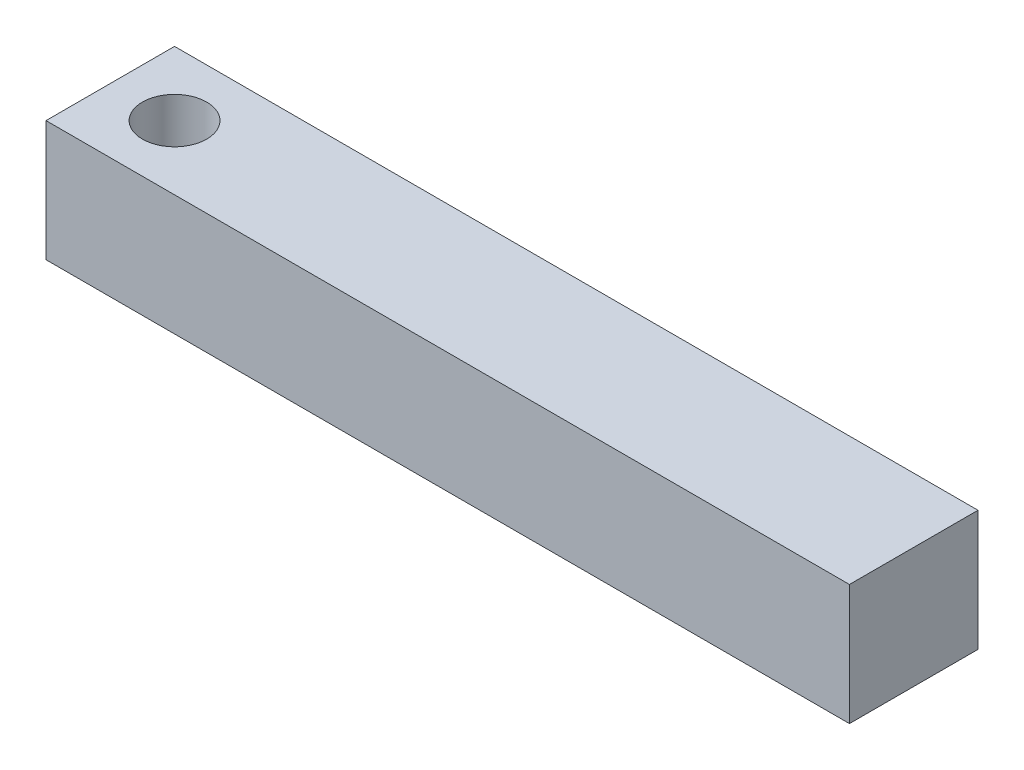
ISO-10303-21;
HEADER;
FILE_DESCRIPTION(('STEP AP214'),'2;1');
FILE_NAME('part.step','',(''),(''),'','','');
FILE_SCHEMA(('AUTOMOTIVE_DESIGN { 1 0 10303 214 1 1 1 1 }'));
ENDSEC;
DATA;
#1=APPLICATION_CONTEXT('core data for automotive mechanical design processes');
#2=APPLICATION_PROTOCOL_DEFINITION('international standard','automotive_design',2000,#1);
#3=PRODUCT_CONTEXT('',#1,'mechanical');
#4=PRODUCT('Part','Part','',(#3));
#5=PRODUCT_RELATED_PRODUCT_CATEGORY('part','',(#4));
#6=PRODUCT_DEFINITION_FORMATION('','',#4);
#7=PRODUCT_DEFINITION_CONTEXT('part definition',#1,'design');
#8=PRODUCT_DEFINITION('design','',#6,#7);
#9=PRODUCT_DEFINITION_SHAPE('','',#8);
#10=(LENGTH_UNIT() NAMED_UNIT(*) SI_UNIT(.MILLI.,.METRE.));
#11=(NAMED_UNIT(*) PLANE_ANGLE_UNIT() SI_UNIT($,.RADIAN.));
#12=(NAMED_UNIT(*) SI_UNIT($,.STERADIAN.) SOLID_ANGLE_UNIT());
#13=UNCERTAINTY_MEASURE_WITH_UNIT(LENGTH_MEASURE(1.E-05),#10,'distance_accuracy_value','');
#14=(GEOMETRIC_REPRESENTATION_CONTEXT(3) GLOBAL_UNCERTAINTY_ASSIGNED_CONTEXT((#13)) GLOBAL_UNIT_ASSIGNED_CONTEXT((#10,
#11,#12)) REPRESENTATION_CONTEXT('',''));
#15=CARTESIAN_POINT('',(0.,0.,0.));
#16=DIRECTION('',(0.,0.,1.));
#17=DIRECTION('',(1.,0.,0.));
#18=AXIS2_PLACEMENT_3D('',#15,#16,#17);
#19=CARTESIAN_POINT('',(0.,15.,0.));
#20=DIRECTION('',(0.,1.,0.));
#21=DIRECTION('',(0.,0.,1.));
#22=AXIS2_PLACEMENT_3D('',#19,#20,#21);
#23=PLANE('',#22);
#24=DIRECTION('',(0.,0.,-1.));
#25=VECTOR('',#24,1.);
#26=CARTESIAN_POINT('',(50.,15.,-8.));
#27=LINE('',#26,#25);
#28=CARTESIAN_POINT('',(50.,15.,8.));
#29=VERTEX_POINT('',#28);
#30=CARTESIAN_POINT('',(50.,15.,-8.));
#31=VERTEX_POINT('',#30);
#32=EDGE_CURVE('E85',#29,#31,#27,.T.);
#33=ORIENTED_EDGE('',*,*,#32,.T.);
#34=DIRECTION('',(-1.,0.,0.));
#35=VECTOR('',#34,1.);
#36=CARTESIAN_POINT('',(-50.,15.,-8.));
#37=LINE('',#36,#35);
#38=CARTESIAN_POINT('',(-50.,15.,-8.));
#39=VERTEX_POINT('',#38);
#40=EDGE_CURVE('E80',#31,#39,#37,.T.);
#41=ORIENTED_EDGE('',*,*,#40,.T.);
#42=DIRECTION('',(0.,0.,1.));
#43=VECTOR('',#42,1.);
#44=CARTESIAN_POINT('',(-50.,15.,-8.));
#45=LINE('',#44,#43);
#46=CARTESIAN_POINT('',(-50.,15.,8.));
#47=VERTEX_POINT('',#46);
#48=EDGE_CURVE('E83',#39,#47,#45,.T.);
#49=ORIENTED_EDGE('',*,*,#48,.T.);
#50=DIRECTION('',(1.,0.,0.));
#51=VECTOR('',#50,1.);
#52=CARTESIAN_POINT('',(-50.,15.,8.));
#53=LINE('',#52,#51);
#54=EDGE_CURVE('E50',#47,#29,#53,.T.);
#55=ORIENTED_EDGE('',*,*,#54,.T.);
#56=EDGE_LOOP('',(#33,#41,#49,#55));
#57=FACE_BOUND('',#56,.T.);
#58=CARTESIAN_POINT('',(-42.,15.,0.));
#59=DIRECTION('',(0.,1.,0.));
#60=DIRECTION('',(0.,0.,1.));
#61=AXIS2_PLACEMENT_3D('',#58,#59,#60);
#62=CIRCLE('',#61,4.00000000000001);
#63=CARTESIAN_POINT('',(-42.,15.,4.00000000000001));
#64=VERTEX_POINT('',#63);
#65=EDGE_CURVE('E100',#64,#64,#62,.T.);
#66=ORIENTED_EDGE('',*,*,#65,.F.);
#67=EDGE_LOOP('',(#66));
#68=FACE_BOUND('',#67,.T.);
#69=ADVANCED_FACE('F33',(#57,#68),#23,.T.);
#70=CARTESIAN_POINT('',(0.,0.,0.));
#71=DIRECTION('',(0.,1.,0.));
#72=DIRECTION('',(0.,0.,1.));
#73=AXIS2_PLACEMENT_3D('',#70,#71,#72);
#74=PLANE('',#73);
#75=DIRECTION('',(0.,0.,-1.));
#76=VECTOR('',#75,1.);
#77=CARTESIAN_POINT('',(50.,0.,-8.));
#78=LINE('',#77,#76);
#79=CARTESIAN_POINT('',(50.,0.,8.));
#80=VERTEX_POINT('',#79);
#81=CARTESIAN_POINT('',(50.,0.,-8.));
#82=VERTEX_POINT('',#81);
#83=EDGE_CURVE('E97',#80,#82,#78,.T.);
#84=ORIENTED_EDGE('',*,*,#83,.F.);
#85=DIRECTION('',(1.,0.,0.));
#86=VECTOR('',#85,1.);
#87=CARTESIAN_POINT('',(-50.,0.,8.));
#88=LINE('',#87,#86);
#89=CARTESIAN_POINT('',(-50.,0.,8.));
#90=VERTEX_POINT('',#89);
#91=EDGE_CURVE('E73',#90,#80,#88,.T.);
#92=ORIENTED_EDGE('',*,*,#91,.F.);
#93=DIRECTION('',(0.,0.,1.));
#94=VECTOR('',#93,1.);
#95=CARTESIAN_POINT('',(-50.,0.,-8.));
#96=LINE('',#95,#94);
#97=CARTESIAN_POINT('',(-50.,0.,-8.));
#98=VERTEX_POINT('',#97);
#99=EDGE_CURVE('E67',#98,#90,#96,.T.);
#100=ORIENTED_EDGE('',*,*,#99,.F.);
#101=DIRECTION('',(-1.,0.,0.));
#102=VECTOR('',#101,1.);
#103=CARTESIAN_POINT('',(-50.,0.,-8.));
#104=LINE('',#103,#102);
#105=EDGE_CURVE('E89',#82,#98,#104,.T.);
#106=ORIENTED_EDGE('',*,*,#105,.F.);
#107=EDGE_LOOP('',(#84,#92,#100,#106));
#108=FACE_BOUND('',#107,.T.);
#109=CARTESIAN_POINT('',(-42.,0.,0.));
#110=DIRECTION('',(0.,1.,0.));
#111=DIRECTION('',(0.,0.,1.));
#112=AXIS2_PLACEMENT_3D('',#109,#110,#111);
#113=CIRCLE('',#112,4.00000000000001);
#114=CARTESIAN_POINT('',(-42.,0.,4.00000000000001));
#115=VERTEX_POINT('',#114);
#116=EDGE_CURVE('E112',#115,#115,#113,.T.);
#117=ORIENTED_EDGE('',*,*,#116,.T.);
#118=EDGE_LOOP('',(#117));
#119=FACE_BOUND('',#118,.T.);
#120=ADVANCED_FACE('F108',(#108,#119),#74,.F.);
#121=CARTESIAN_POINT('',(50.,15.,-8.));
#122=DIRECTION('',(-1.,0.,0.));
#123=DIRECTION('',(0.,0.,1.));
#124=AXIS2_PLACEMENT_3D('',#121,#122,#123);
#125=PLANE('',#124);
#126=ORIENTED_EDGE('',*,*,#83,.T.);
#127=DIRECTION('',(0.,-1.,0.));
#128=VECTOR('',#127,1.);
#129=CARTESIAN_POINT('',(50.,15.,-8.));
#130=LINE('',#129,#128);
#131=EDGE_CURVE('E11',#31,#82,#130,.T.);
#132=ORIENTED_EDGE('',*,*,#131,.F.);
#133=ORIENTED_EDGE('',*,*,#32,.F.);
#134=DIRECTION('',(0.,-1.,0.));
#135=VECTOR('',#134,1.);
#136=CARTESIAN_POINT('',(50.,15.,8.));
#137=LINE('',#136,#135);
#138=EDGE_CURVE('E93',#29,#80,#137,.T.);
#139=ORIENTED_EDGE('',*,*,#138,.T.);
#140=EDGE_LOOP('',(#126,#132,#133,#139));
#141=FACE_BOUND('',#140,.T.);
#142=ADVANCED_FACE('F35',(#141),#125,.F.);
#143=CARTESIAN_POINT('',(-50.,15.,-8.));
#144=DIRECTION('',(0.,0.,1.));
#145=DIRECTION('',(1.,0.,0.));
#146=AXIS2_PLACEMENT_3D('',#143,#144,#145);
#147=PLANE('',#146);
#148=ORIENTED_EDGE('',*,*,#105,.T.);
#149=DIRECTION('',(0.,-1.,0.));
#150=VECTOR('',#149,1.);
#151=CARTESIAN_POINT('',(-50.,15.,-8.));
#152=LINE('',#151,#150);
#153=EDGE_CURVE('E42',#39,#98,#152,.T.);
#154=ORIENTED_EDGE('',*,*,#153,.F.);
#155=ORIENTED_EDGE('',*,*,#40,.F.);
#156=ORIENTED_EDGE('',*,*,#131,.T.);
#157=EDGE_LOOP('',(#148,#154,#155,#156));
#158=FACE_BOUND('',#157,.T.);
#159=ADVANCED_FACE('F88',(#158),#147,.F.);
#160=CARTESIAN_POINT('',(-50.,15.,-8.));
#161=DIRECTION('',(1.,0.,0.));
#162=DIRECTION('',(0.,0.,-1.));
#163=AXIS2_PLACEMENT_3D('',#160,#161,#162);
#164=PLANE('',#163);
#165=ORIENTED_EDGE('',*,*,#99,.T.);
#166=DIRECTION('',(0.,-1.,0.));
#167=VECTOR('',#166,1.);
#168=CARTESIAN_POINT('',(-50.,15.,8.));
#169=LINE('',#168,#167);
#170=EDGE_CURVE('E90',#47,#90,#169,.T.);
#171=ORIENTED_EDGE('',*,*,#170,.F.);
#172=ORIENTED_EDGE('',*,*,#48,.F.);
#173=ORIENTED_EDGE('',*,*,#153,.T.);
#174=EDGE_LOOP('',(#165,#171,#172,#173));
#175=FACE_BOUND('',#174,.T.);
#176=ADVANCED_FACE('F91',(#175),#164,.F.);
#177=CARTESIAN_POINT('',(-50.,15.,8.));
#178=DIRECTION('',(0.,0.,-1.));
#179=DIRECTION('',(-1.,0.,0.));
#180=AXIS2_PLACEMENT_3D('',#177,#178,#179);
#181=PLANE('',#180);
#182=ORIENTED_EDGE('',*,*,#91,.T.);
#183=ORIENTED_EDGE('',*,*,#138,.F.);
#184=ORIENTED_EDGE('',*,*,#54,.F.);
#185=ORIENTED_EDGE('',*,*,#170,.T.);
#186=EDGE_LOOP('',(#182,#183,#184,#185));
#187=FACE_BOUND('',#186,.T.);
#188=ADVANCED_FACE('F105',(#187),#181,.F.);
#189=CARTESIAN_POINT('',(-42.,15.,0.));
#190=DIRECTION('',(0.,-1.,0.));
#191=DIRECTION('',(0.,0.,-1.));
#192=AXIS2_PLACEMENT_3D('',#189,#190,#191);
#193=CYLINDRICAL_SURFACE('',#192,4.00000000000001);
#194=ORIENTED_EDGE('',*,*,#65,.T.);
#195=EDGE_LOOP('',(#194));
#196=FACE_BOUND('',#195,.T.);
#197=ORIENTED_EDGE('',*,*,#116,.F.);
#198=EDGE_LOOP('',(#197));
#199=FACE_BOUND('',#198,.T.);
#200=ADVANCED_FACE('F118',(#196,#199),#193,.F.);
#201=CLOSED_SHELL('',(#69,#120,#142,#159,#176,#188,#200));
#202=MANIFOLD_SOLID_BREP('B2',#201);
#203=ADVANCED_BREP_SHAPE_REPRESENTATION('',(#18,#202),#14);
#204=SHAPE_DEFINITION_REPRESENTATION(#9,#203);
ENDSEC;
END-ISO-10303-21;
